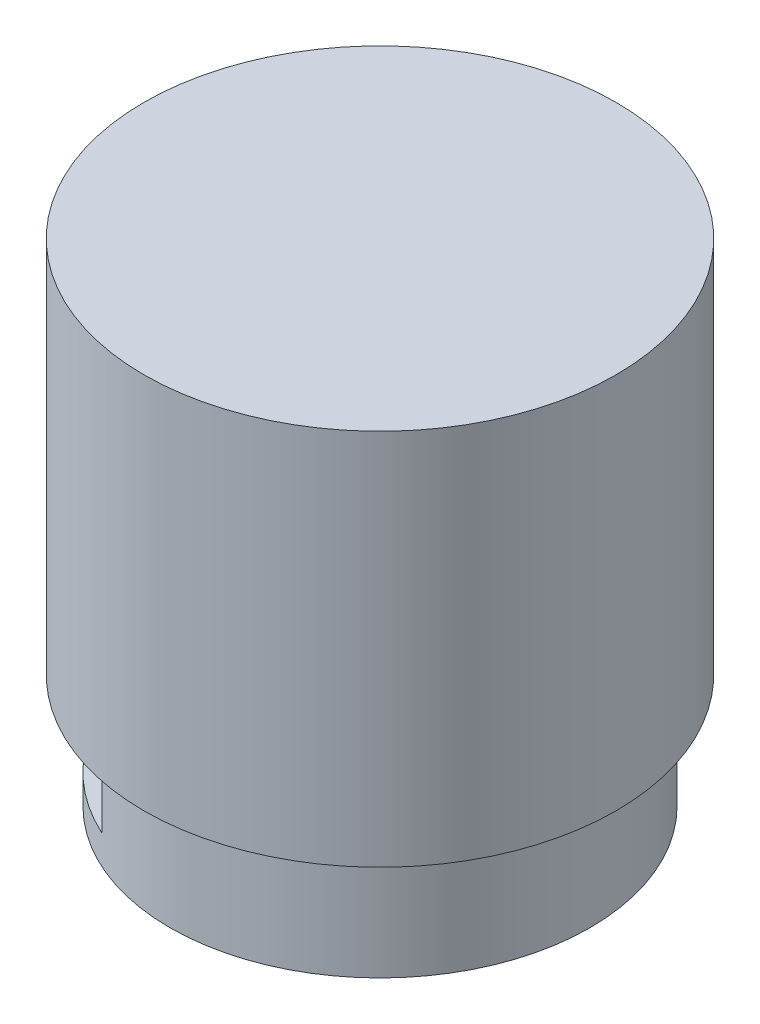
ISO-10303-21;
HEADER;
FILE_DESCRIPTION(('STEP AP214'),'2;1');
FILE_NAME('part.step','',(''),(''),'','','');
FILE_SCHEMA(('AUTOMOTIVE_DESIGN { 1 0 10303 214 1 1 1 1 }'));
ENDSEC;
DATA;
#1=APPLICATION_CONTEXT('core data for automotive mechanical design processes');
#2=APPLICATION_PROTOCOL_DEFINITION('international standard','automotive_design',2000,#1);
#3=PRODUCT_CONTEXT('',#1,'mechanical');
#4=PRODUCT('Part','Part','',(#3));
#5=PRODUCT_RELATED_PRODUCT_CATEGORY('part','',(#4));
#6=PRODUCT_DEFINITION_FORMATION('','',#4);
#7=PRODUCT_DEFINITION_CONTEXT('part definition',#1,'design');
#8=PRODUCT_DEFINITION('design','',#6,#7);
#9=PRODUCT_DEFINITION_SHAPE('','',#8);
#10=(LENGTH_UNIT() NAMED_UNIT(*) SI_UNIT(.MILLI.,.METRE.));
#11=(NAMED_UNIT(*) PLANE_ANGLE_UNIT() SI_UNIT($,.RADIAN.));
#12=(NAMED_UNIT(*) SI_UNIT($,.STERADIAN.) SOLID_ANGLE_UNIT());
#13=UNCERTAINTY_MEASURE_WITH_UNIT(LENGTH_MEASURE(1.E-05),#10,'distance_accuracy_value','');
#14=(GEOMETRIC_REPRESENTATION_CONTEXT(3) GLOBAL_UNCERTAINTY_ASSIGNED_CONTEXT((#13)) GLOBAL_UNIT_ASSIGNED_CONTEXT((#10,
#11,#12)) REPRESENTATION_CONTEXT('',''));
#15=CARTESIAN_POINT('',(0.,0.,0.));
#16=DIRECTION('',(0.,0.,1.));
#17=DIRECTION('',(1.,0.,0.));
#18=AXIS2_PLACEMENT_3D('',#15,#16,#17);
#19=CARTESIAN_POINT('',(0.,9.1,0.));
#20=DIRECTION('',(0.,-1.,0.));
#21=DIRECTION('',(0.,0.,-1.));
#22=AXIS2_PLACEMENT_3D('',#19,#20,#21);
#23=CYLINDRICAL_SURFACE('',#22,20.25);
#24=CARTESIAN_POINT('',(0.,9.1,0.));
#25=DIRECTION('',(0.,1.,0.));
#26=DIRECTION('',(0.,0.,1.));
#27=AXIS2_PLACEMENT_3D('',#24,#25,#26);
#28=CIRCLE('',#27,20.25);
#29=CARTESIAN_POINT('',(0.,9.1,20.25));
#30=VERTEX_POINT('',#29);
#31=CARTESIAN_POINT('',(0.,9.1,-20.25));
#32=VERTEX_POINT('',#31);
#33=EDGE_CURVE('E102',#30,#32,#28,.T.);
#34=ORIENTED_EDGE('',*,*,#33,.T.);
#35=DIRECTION('',(0.,-1.,0.));
#36=VECTOR('',#35,1.);
#37=CARTESIAN_POINT('',(0.,55.3094416759173,-20.25));
#38=LINE('',#37,#36);
#39=CARTESIAN_POINT('',(0.,3.1,-20.25));
#40=VERTEX_POINT('',#39);
#41=EDGE_CURVE('E63',#32,#40,#38,.T.);
#42=ORIENTED_EDGE('',*,*,#41,.T.);
#43=CARTESIAN_POINT('',(0.,3.1,0.));
#44=DIRECTION('',(0.,1.,0.));
#45=DIRECTION('',(0.,0.,1.));
#46=AXIS2_PLACEMENT_3D('',#43,#44,#45);
#47=CIRCLE('',#46,20.25);
#48=CARTESIAN_POINT('',(0.,3.1,20.25));
#49=VERTEX_POINT('',#48);
#50=EDGE_CURVE('E11',#40,#49,#47,.F.);
#51=ORIENTED_EDGE('',*,*,#50,.T.);
#52=DIRECTION('',(0.,-1.,0.));
#53=VECTOR('',#52,1.);
#54=CARTESIAN_POINT('',(0.,55.3094416759173,20.25));
#55=LINE('',#54,#53);
#56=EDGE_CURVE('E95',#30,#49,#55,.T.);
#57=ORIENTED_EDGE('',*,*,#56,.F.);
#58=EDGE_LOOP('',(#34,#42,#51,#57));
#59=FACE_BOUND('',#58,.T.);
#60=ADVANCED_FACE('F39',(#59),#23,.F.);
#61=CARTESIAN_POINT('',(0.,3.1,0.));
#62=DIRECTION('',(0.,1.,0.));
#63=DIRECTION('',(0.,0.,1.));
#64=AXIS2_PLACEMENT_3D('',#61,#62,#63);
#65=PLANE('',#64);
#66=CARTESIAN_POINT('',(0.,3.1,0.));
#67=DIRECTION('',(0.,1.,0.));
#68=DIRECTION('',(0.,0.,1.));
#69=AXIS2_PLACEMENT_3D('',#66,#67,#68);
#70=CIRCLE('',#69,15.275);
#71=CARTESIAN_POINT('',(0.,3.1,-15.275));
#72=VERTEX_POINT('',#71);
#73=EDGE_CURVE('E137',#72,#72,#70,.T.);
#74=ORIENTED_EDGE('',*,*,#73,.F.);
#75=EDGE_LOOP('',(#74));
#76=FACE_BOUND('',#75,.T.);
#77=ORIENTED_EDGE('',*,*,#50,.F.);
#78=DIRECTION('',(-1.,0.,0.));
#79=VECTOR('',#78,1.);
#80=CARTESIAN_POINT('',(0.,3.1,-20.25));
#81=LINE('',#80,#79);
#82=CARTESIAN_POINT('',(-9.21954445729288,3.1,-20.25));
#83=VERTEX_POINT('',#82);
#84=EDGE_CURVE('E92',#40,#83,#81,.T.);
#85=ORIENTED_EDGE('',*,*,#84,.T.);
#86=CARTESIAN_POINT('',(0.,3.1,0.));
#87=DIRECTION('',(0.,-1.,0.));
#88=DIRECTION('',(0.,0.,-1.));
#89=AXIS2_PLACEMENT_3D('',#86,#87,#88);
#90=CIRCLE('',#89,22.25);
#91=CARTESIAN_POINT('',(-9.21954445729289,3.1,20.25));
#92=VERTEX_POINT('',#91);
#93=EDGE_CURVE('E87',#92,#83,#90,.T.);
#94=ORIENTED_EDGE('',*,*,#93,.F.);
#95=DIRECTION('',(1.,0.,0.));
#96=VECTOR('',#95,1.);
#97=CARTESIAN_POINT('',(0.,3.1,20.25));
#98=LINE('',#97,#96);
#99=EDGE_CURVE('E83',#92,#49,#98,.T.);
#100=ORIENTED_EDGE('',*,*,#99,.T.);
#101=EDGE_LOOP('',(#77,#85,#94,#100));
#102=FACE_BOUND('',#101,.T.);
#103=ADVANCED_FACE('F85',(#76,#102),#65,.T.);
#104=CARTESIAN_POINT('',(0.,0.,0.));
#105=DIRECTION('',(0.,1.,0.));
#106=DIRECTION('',(0.,0.,1.));
#107=AXIS2_PLACEMENT_3D('',#104,#105,#106);
#108=PLANE('',#107);
#109=CARTESIAN_POINT('',(0.,0.,0.));
#110=DIRECTION('',(0.,1.,0.));
#111=DIRECTION('',(0.,0.,1.));
#112=AXIS2_PLACEMENT_3D('',#109,#110,#111);
#113=CIRCLE('',#112,22.25);
#114=CARTESIAN_POINT('',(0.,0.,22.25));
#115=VERTEX_POINT('',#114);
#116=EDGE_CURVE('E48',#115,#115,#113,.T.);
#117=ORIENTED_EDGE('',*,*,#116,.F.);
#118=EDGE_LOOP('',(#117));
#119=FACE_BOUND('',#118,.T.);
#120=CARTESIAN_POINT('',(0.,0.,0.));
#121=DIRECTION('',(0.,1.,0.));
#122=DIRECTION('',(0.,0.,1.));
#123=AXIS2_PLACEMENT_3D('',#120,#121,#122);
#124=CIRCLE('',#123,15.275);
#125=CARTESIAN_POINT('',(0.,0.,-15.275));
#126=VERTEX_POINT('',#125);
#127=EDGE_CURVE('E136',#126,#126,#124,.T.);
#128=ORIENTED_EDGE('',*,*,#127,.T.);
#129=EDGE_LOOP('',(#128));
#130=FACE_BOUND('',#129,.T.);
#131=ADVANCED_FACE('F149',(#119,#130),#108,.F.);
#132=CARTESIAN_POINT('',(0.,3.1,0.));
#133=DIRECTION('',(0.,-1.,0.));
#134=DIRECTION('',(0.,0.,-1.));
#135=AXIS2_PLACEMENT_3D('',#132,#133,#134);
#136=CYLINDRICAL_SURFACE('',#135,22.25);
#137=DIRECTION('',(0.,-1.,0.));
#138=VECTOR('',#137,1.);
#139=CARTESIAN_POINT('',(-9.2195444572929,3.1,20.25));
#140=LINE('',#139,#138);
#141=CARTESIAN_POINT('',(-9.21954445729289,9.1,20.25));
#142=VERTEX_POINT('',#141);
#143=EDGE_CURVE('E110',#92,#142,#140,.F.);
#144=ORIENTED_EDGE('',*,*,#143,.F.);
#145=ORIENTED_EDGE('',*,*,#93,.T.);
#146=DIRECTION('',(0.,-1.,0.));
#147=VECTOR('',#146,1.);
#148=CARTESIAN_POINT('',(-9.21954445729289,3.1,-20.25));
#149=LINE('',#148,#147);
#150=CARTESIAN_POINT('',(-9.21954445729288,9.1,-20.25));
#151=VERTEX_POINT('',#150);
#152=EDGE_CURVE('E113',#151,#83,#149,.T.);
#153=ORIENTED_EDGE('',*,*,#152,.F.);
#154=CARTESIAN_POINT('',(0.,9.1,0.));
#155=DIRECTION('',(0.,1.,0.));
#156=DIRECTION('',(0.,0.,1.));
#157=AXIS2_PLACEMENT_3D('',#154,#155,#156);
#158=CIRCLE('',#157,22.25);
#159=EDGE_CURVE('E55',#151,#142,#158,.T.);
#160=ORIENTED_EDGE('',*,*,#159,.T.);
#161=EDGE_LOOP('',(#144,#145,#153,#160));
#162=FACE_BOUND('',#161,.T.);
#163=ORIENTED_EDGE('',*,*,#116,.T.);
#164=EDGE_LOOP('',(#163));
#165=FACE_BOUND('',#164,.T.);
#166=CARTESIAN_POINT('',(0.,12.1,0.));
#167=DIRECTION('',(0.,1.,0.));
#168=DIRECTION('',(0.,0.,1.));
#169=AXIS2_PLACEMENT_3D('',#166,#167,#168);
#170=CIRCLE('',#169,22.25);
#171=CARTESIAN_POINT('',(0.,12.1,22.25));
#172=VERTEX_POINT('',#171);
#173=EDGE_CURVE('E127',#172,#172,#170,.T.);
#174=ORIENTED_EDGE('',*,*,#173,.F.);
#175=EDGE_LOOP('',(#174));
#176=FACE_BOUND('',#175,.T.);
#177=ADVANCED_FACE('F41',(#162,#165,#176),#136,.T.);
#178=CARTESIAN_POINT('',(0.,3.1,0.));
#179=DIRECTION('',(0.,-1.,0.));
#180=DIRECTION('',(0.,0.,-1.));
#181=AXIS2_PLACEMENT_3D('',#178,#179,#180);
#182=CYLINDRICAL_SURFACE('',#181,15.275);
#183=CARTESIAN_POINT('',(0.,3.1,-15.275));
#184=CARTESIAN_POINT('',(0.,3.06770833333333,-15.275));
#185=CARTESIAN_POINT('',(0.,3.03541666666667,-15.275));
#186=CARTESIAN_POINT('',(0.,2.97083333333333,-15.275));
#187=CARTESIAN_POINT('',(0.,2.93854166666667,-15.275));
#188=CARTESIAN_POINT('',(0.,2.87395833333333,-15.275));
#189=CARTESIAN_POINT('',(0.,2.84166666666667,-15.275));
#190=CARTESIAN_POINT('',(0.,2.77708333333333,-15.275));
#191=CARTESIAN_POINT('',(0.,2.74479166666667,-15.275));
#192=CARTESIAN_POINT('',(0.,2.68020833333333,-15.275));
#193=CARTESIAN_POINT('',(0.,2.64791666666667,-15.275));
#194=CARTESIAN_POINT('',(0.,2.58333333333333,-15.275));
#195=CARTESIAN_POINT('',(0.,2.55104166666667,-15.275));
#196=CARTESIAN_POINT('',(0.,2.48645833333333,-15.275));
#197=CARTESIAN_POINT('',(0.,2.45416666666667,-15.275));
#198=CARTESIAN_POINT('',(0.,2.38958333333333,-15.275));
#199=CARTESIAN_POINT('',(0.,2.35729166666667,-15.275));
#200=CARTESIAN_POINT('',(0.,2.29270833333333,-15.275));
#201=CARTESIAN_POINT('',(0.,2.26041666666667,-15.275));
#202=CARTESIAN_POINT('',(0.,2.19583333333333,-15.275));
#203=CARTESIAN_POINT('',(0.,2.16354166666667,-15.275));
#204=CARTESIAN_POINT('',(0.,2.09895833333333,-15.275));
#205=CARTESIAN_POINT('',(0.,2.06666666666667,-15.275));
#206=CARTESIAN_POINT('',(0.,2.00208333333333,-15.275));
#207=CARTESIAN_POINT('',(0.,1.96979166666667,-15.275));
#208=CARTESIAN_POINT('',(0.,1.90520833333333,-15.275));
#209=CARTESIAN_POINT('',(0.,1.87291666666667,-15.275));
#210=CARTESIAN_POINT('',(0.,1.80833333333333,-15.275));
#211=CARTESIAN_POINT('',(0.,1.77604166666667,-15.275));
#212=CARTESIAN_POINT('',(0.,1.71145833333333,-15.275));
#213=CARTESIAN_POINT('',(0.,1.67916666666667,-15.275));
#214=CARTESIAN_POINT('',(0.,1.61458333333333,-15.275));
#215=CARTESIAN_POINT('',(0.,1.58229166666667,-15.275));
#216=CARTESIAN_POINT('',(0.,1.51770833333333,-15.275));
#217=CARTESIAN_POINT('',(0.,1.48541666666667,-15.275));
#218=CARTESIAN_POINT('',(0.,1.42083333333333,-15.275));
#219=CARTESIAN_POINT('',(0.,1.38854166666667,-15.275));
#220=CARTESIAN_POINT('',(0.,1.32395833333333,-15.275));
#221=CARTESIAN_POINT('',(0.,1.29166666666667,-15.275));
#222=CARTESIAN_POINT('',(0.,1.22708333333333,-15.275));
#223=CARTESIAN_POINT('',(0.,1.19479166666667,-15.275));
#224=CARTESIAN_POINT('',(0.,1.13020833333333,-15.275));
#225=CARTESIAN_POINT('',(0.,1.09791666666667,-15.275));
#226=CARTESIAN_POINT('',(0.,1.03333333333333,-15.275));
#227=CARTESIAN_POINT('',(0.,1.00104166666667,-15.275));
#228=CARTESIAN_POINT('',(0.,0.936458333333333,-15.275));
#229=CARTESIAN_POINT('',(0.,0.904166666666667,-15.275));
#230=CARTESIAN_POINT('',(0.,0.839583333333334,-15.275));
#231=CARTESIAN_POINT('',(0.,0.807291666666667,-15.275));
#232=CARTESIAN_POINT('',(0.,0.742708333333333,-15.275));
#233=CARTESIAN_POINT('',(0.,0.710416666666667,-15.275));
#234=CARTESIAN_POINT('',(0.,0.645833333333333,-15.275));
#235=CARTESIAN_POINT('',(0.,0.613541666666667,-15.275));
#236=CARTESIAN_POINT('',(0.,0.548958333333333,-15.275));
#237=CARTESIAN_POINT('',(0.,0.516666666666667,-15.275));
#238=CARTESIAN_POINT('',(0.,0.452083333333333,-15.275));
#239=CARTESIAN_POINT('',(0.,0.419791666666667,-15.275));
#240=CARTESIAN_POINT('',(0.,0.355208333333333,-15.275));
#241=CARTESIAN_POINT('',(0.,0.322916666666667,-15.275));
#242=CARTESIAN_POINT('',(0.,0.258333333333333,-15.275));
#243=CARTESIAN_POINT('',(0.,0.226041666666667,-15.275));
#244=CARTESIAN_POINT('',(0.,0.161458333333333,-15.275));
#245=CARTESIAN_POINT('',(0.,0.129166666666667,-15.275));
#246=CARTESIAN_POINT('',(0.,0.0645833333333335,-15.275));
#247=CARTESIAN_POINT('',(0.,0.0322916666666667,-15.275));
#248=CARTESIAN_POINT('',(0.,0.,-15.275));
#249=B_SPLINE_CURVE_WITH_KNOTS('',3,(#183,#184,#185,#186,#187,#188,#189,#190,#191,#192,#193,
#194,#195,#196,#197,#198,#199,#200,#201,#202,#203,#204,#205,#206,#207,#208,#209,#210,#211,#212,
#213,#214,#215,#216,#217,#218,#219,#220,#221,#222,#223,#224,#225,#226,#227,#228,#229,#230,#231,
#232,#233,#234,#235,#236,#237,#238,#239,#240,#241,#242,#243,#244,#245,#246,#247,#248),
.UNSPECIFIED.,.F.,.F.,(4,2,2,2,2,2,2,2,2,2,2,2,2,2,2,2,2,2,2,2,2,2,2,2,2,2,2,2,2,2,2,2,4),(0.,
0.0968750000000002,0.19375,0.290625,0.3875,0.484375,0.58125,0.678125,0.775,0.871875,0.96875,
1.065625,1.1625,1.259375,1.35625,1.453125,1.55,1.646875,1.74375,1.840625,1.9375,2.034375,
2.13125,2.228125,2.325,2.421875,2.51875,2.615625,2.7125,2.809375,2.90625,3.003125,3.1),.UNSPECIFIED.);
#250=EDGE_CURVE('BSEAM154',#72,#126,#249,.T.);
#251=ORIENTED_EDGE('',*,*,#73,.T.);
#252=ORIENTED_EDGE('',*,*,#127,.F.);
#253=ORIENTED_EDGE('',*,*,#250,.T.);
#254=ORIENTED_EDGE('',*,*,#250,.F.);
#255=EDGE_LOOP('',(#251,#253,#252,#254));
#256=FACE_BOUND('',#255,.T.);
#257=ADVANCED_FACE('F154',(#256),#182,.F.);
#258=CARTESIAN_POINT('',(0.,9.1,0.));
#259=DIRECTION('',(0.,1.,0.));
#260=DIRECTION('',(0.,0.,1.));
#261=AXIS2_PLACEMENT_3D('',#258,#259,#260);
#262=PLANE('',#261);
#263=ORIENTED_EDGE('',*,*,#33,.F.);
#264=DIRECTION('',(1.,0.,0.));
#265=VECTOR('',#264,1.);
#266=CARTESIAN_POINT('',(0.,9.1,20.25));
#267=LINE('',#266,#265);
#268=EDGE_CURVE('E91',#142,#30,#267,.T.);
#269=ORIENTED_EDGE('',*,*,#268,.F.);
#270=ORIENTED_EDGE('',*,*,#159,.F.);
#271=DIRECTION('',(-1.,0.,0.));
#272=VECTOR('',#271,1.);
#273=CARTESIAN_POINT('',(0.,9.1,-20.25));
#274=LINE('',#273,#272);
#275=EDGE_CURVE('E114',#32,#151,#274,.T.);
#276=ORIENTED_EDGE('',*,*,#275,.F.);
#277=EDGE_LOOP('',(#263,#269,#270,#276));
#278=FACE_BOUND('',#277,.T.);
#279=ADVANCED_FACE('F156',(#278),#262,.F.);
#280=CARTESIAN_POINT('',(0.,52.1,0.));
#281=DIRECTION('',(0.,-1.,0.));
#282=DIRECTION('',(0.,0.,-1.));
#283=AXIS2_PLACEMENT_3D('',#280,#281,#282);
#284=CYLINDRICAL_SURFACE('',#283,25.);
#285=CARTESIAN_POINT('',(0.,52.1,0.));
#286=DIRECTION('',(0.,1.,0.));
#287=DIRECTION('',(0.,0.,1.));
#288=AXIS2_PLACEMENT_3D('',#285,#286,#287);
#289=CIRCLE('',#288,25.);
#290=CARTESIAN_POINT('',(0.,52.1,25.));
#291=VERTEX_POINT('',#290);
#292=EDGE_CURVE('E123',#291,#291,#289,.T.);
#293=ORIENTED_EDGE('',*,*,#292,.F.);
#294=EDGE_LOOP('',(#293));
#295=FACE_BOUND('',#294,.T.);
#296=CARTESIAN_POINT('',(0.,12.1,0.));
#297=DIRECTION('',(0.,1.,0.));
#298=DIRECTION('',(0.,0.,1.));
#299=AXIS2_PLACEMENT_3D('',#296,#297,#298);
#300=CIRCLE('',#299,25.);
#301=CARTESIAN_POINT('',(0.,12.1,25.));
#302=VERTEX_POINT('',#301);
#303=EDGE_CURVE('E122',#302,#302,#300,.T.);
#304=ORIENTED_EDGE('',*,*,#303,.T.);
#305=EDGE_LOOP('',(#304));
#306=FACE_BOUND('',#305,.T.);
#307=ADVANCED_FACE('F163',(#295,#306),#284,.T.);
#308=CARTESIAN_POINT('',(0.,52.1,0.));
#309=DIRECTION('',(0.,1.,0.));
#310=DIRECTION('',(0.,0.,1.));
#311=AXIS2_PLACEMENT_3D('',#308,#309,#310);
#312=PLANE('',#311);
#313=ORIENTED_EDGE('',*,*,#292,.T.);
#314=EDGE_LOOP('',(#313));
#315=FACE_BOUND('',#314,.T.);
#316=ADVANCED_FACE('F176',(#315),#312,.T.);
#317=CARTESIAN_POINT('',(0.,12.1,0.));
#318=DIRECTION('',(0.,1.,0.));
#319=DIRECTION('',(0.,0.,1.));
#320=AXIS2_PLACEMENT_3D('',#317,#318,#319);
#321=PLANE('',#320);
#322=ORIENTED_EDGE('',*,*,#173,.T.);
#323=EDGE_LOOP('',(#322));
#324=FACE_BOUND('',#323,.T.);
#325=ORIENTED_EDGE('',*,*,#303,.F.);
#326=EDGE_LOOP('',(#325));
#327=FACE_BOUND('',#326,.T.);
#328=ADVANCED_FACE('F178',(#324,#327),#321,.F.);
#329=CARTESIAN_POINT('',(0.,55.3094416759173,-20.25));
#330=DIRECTION('',(0.,0.,1.));
#331=DIRECTION('',(1.,0.,0.));
#332=AXIS2_PLACEMENT_3D('',#329,#330,#331);
#333=PLANE('',#332);
#334=ORIENTED_EDGE('',*,*,#152,.T.);
#335=ORIENTED_EDGE('',*,*,#84,.F.);
#336=ORIENTED_EDGE('',*,*,#41,.F.);
#337=ORIENTED_EDGE('',*,*,#275,.T.);
#338=EDGE_LOOP('',(#334,#335,#336,#337));
#339=FACE_BOUND('',#338,.T.);
#340=ADVANCED_FACE('F181',(#339),#333,.T.);
#341=CARTESIAN_POINT('',(0.,55.3094416759173,20.25));
#342=DIRECTION('',(0.,0.,-1.));
#343=DIRECTION('',(-1.,0.,0.));
#344=AXIS2_PLACEMENT_3D('',#341,#342,#343);
#345=PLANE('',#344);
#346=ORIENTED_EDGE('',*,*,#143,.T.);
#347=ORIENTED_EDGE('',*,*,#268,.T.);
#348=ORIENTED_EDGE('',*,*,#56,.T.);
#349=ORIENTED_EDGE('',*,*,#99,.F.);
#350=EDGE_LOOP('',(#346,#347,#348,#349));
#351=FACE_BOUND('',#350,.T.);
#352=ADVANCED_FACE('F96',(#351),#345,.T.);
#353=CLOSED_SHELL('',(#60,#103,#131,#177,#257,#279,#307,#316,#328,#340,#352));
#354=MANIFOLD_SOLID_BREP('B2',#353);
#355=ADVANCED_BREP_SHAPE_REPRESENTATION('',(#18,#354),#14);
#356=SHAPE_DEFINITION_REPRESENTATION(#9,#355);
ENDSEC;
END-ISO-10303-21;
